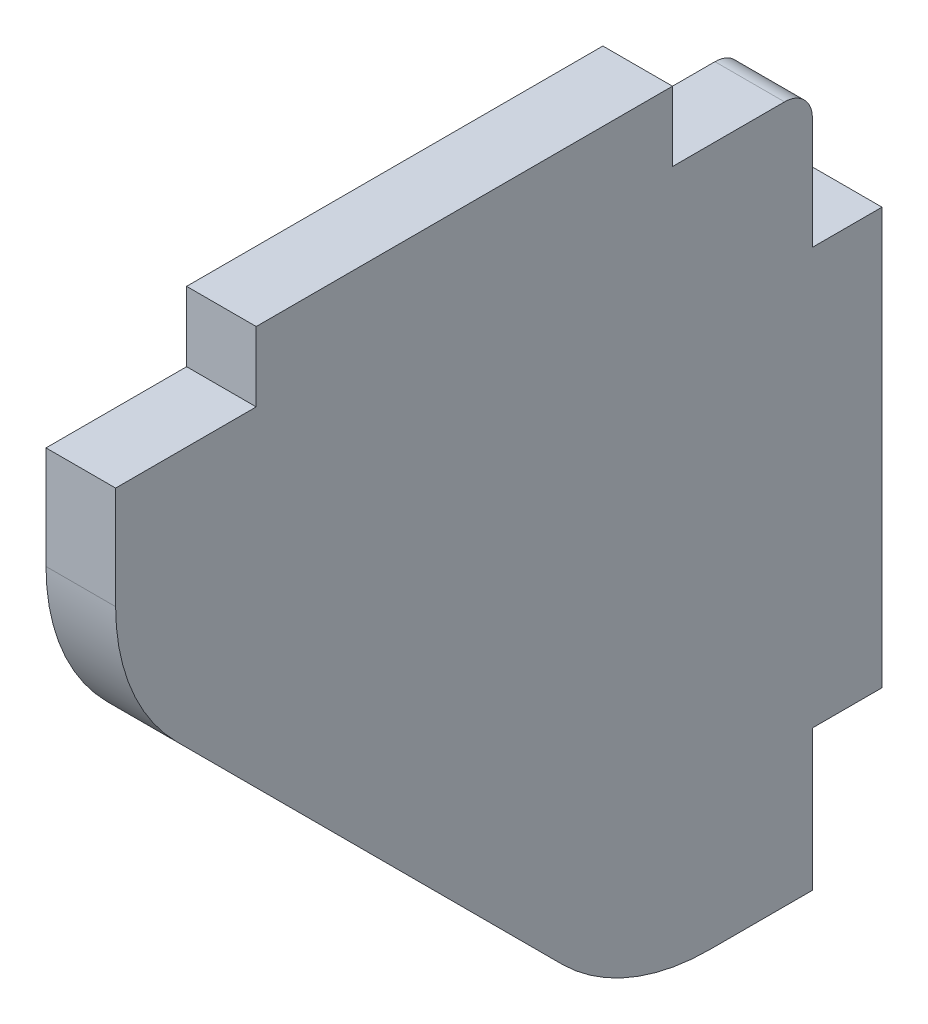
ISO-10303-21;
HEADER;
FILE_DESCRIPTION(('STEP AP214'),'2;1');
FILE_NAME('part.step','',(''),(''),'','','');
FILE_SCHEMA(('AUTOMOTIVE_DESIGN { 1 0 10303 214 1 1 1 1 }'));
ENDSEC;
DATA;
#1=APPLICATION_CONTEXT('core data for automotive mechanical design processes');
#2=APPLICATION_PROTOCOL_DEFINITION('international standard','automotive_design',2000,#1);
#3=PRODUCT_CONTEXT('',#1,'mechanical');
#4=PRODUCT('Part','Part','',(#3));
#5=PRODUCT_RELATED_PRODUCT_CATEGORY('part','',(#4));
#6=PRODUCT_DEFINITION_FORMATION('','',#4);
#7=PRODUCT_DEFINITION_CONTEXT('part definition',#1,'design');
#8=PRODUCT_DEFINITION('design','',#6,#7);
#9=PRODUCT_DEFINITION_SHAPE('','',#8);
#10=(LENGTH_UNIT() NAMED_UNIT(*) SI_UNIT(.MILLI.,.METRE.));
#11=(NAMED_UNIT(*) PLANE_ANGLE_UNIT() SI_UNIT($,.RADIAN.));
#12=(NAMED_UNIT(*) SI_UNIT($,.STERADIAN.) SOLID_ANGLE_UNIT());
#13=UNCERTAINTY_MEASURE_WITH_UNIT(LENGTH_MEASURE(1.E-05),#10,'distance_accuracy_value','');
#14=(GEOMETRIC_REPRESENTATION_CONTEXT(3) GLOBAL_UNCERTAINTY_ASSIGNED_CONTEXT((#13)) GLOBAL_UNIT_ASSIGNED_CONTEXT((#10,
#11,#12)) REPRESENTATION_CONTEXT('',''));
#15=CARTESIAN_POINT('',(0.,0.,0.));
#16=DIRECTION('',(0.,0.,1.));
#17=DIRECTION('',(1.,0.,0.));
#18=AXIS2_PLACEMENT_3D('',#15,#16,#17);
#19=CARTESIAN_POINT('',(145.9,0.,-49.9500000000004));
#20=DIRECTION('',(0.,-1.,0.));
#21=DIRECTION('',(0.,0.,-1.));
#22=AXIS2_PLACEMENT_3D('',#19,#20,#21);
#23=PLANE('',#22);
#24=DIRECTION('',(0.,0.,1.));
#25=VECTOR('',#24,1.);
#26=CARTESIAN_POINT('',(140.9,0.,-49.9500000000004));
#27=LINE('',#26,#25);
#28=CARTESIAN_POINT('',(140.9,0.,-49.9500000000004));
#29=VERTEX_POINT('',#28);
#30=CARTESIAN_POINT('',(140.9,0.,-20.0500000000004));
#31=VERTEX_POINT('',#30);
#32=EDGE_CURVE('E179',#29,#31,#27,.T.);
#33=ORIENTED_EDGE('',*,*,#32,.T.);
#34=DIRECTION('',(-1.,0.,0.));
#35=VECTOR('',#34,1.);
#36=CARTESIAN_POINT('',(145.9,0.,-20.0500000000004));
#37=LINE('',#36,#35);
#38=CARTESIAN_POINT('',(145.9,0.,-20.0500000000004));
#39=VERTEX_POINT('',#38);
#40=EDGE_CURVE('E11',#39,#31,#37,.T.);
#41=ORIENTED_EDGE('',*,*,#40,.F.);
#42=DIRECTION('',(0.,0.,1.));
#43=VECTOR('',#42,1.);
#44=CARTESIAN_POINT('',(145.9,0.,-49.9500000000004));
#45=LINE('',#44,#43);
#46=CARTESIAN_POINT('',(145.9,0.,-49.9500000000004));
#47=VERTEX_POINT('',#46);
#48=EDGE_CURVE('E209',#47,#39,#45,.T.);
#49=ORIENTED_EDGE('',*,*,#48,.F.);
#50=DIRECTION('',(-1.,0.,0.));
#51=VECTOR('',#50,1.);
#52=CARTESIAN_POINT('',(145.9,0.,-49.9500000000004));
#53=LINE('',#52,#51);
#54=EDGE_CURVE('E175',#47,#29,#53,.T.);
#55=ORIENTED_EDGE('',*,*,#54,.T.);
#56=EDGE_LOOP('',(#33,#41,#49,#55));
#57=FACE_BOUND('',#56,.T.);
#58=ADVANCED_FACE('F35',(#57),#23,.F.);
#59=CARTESIAN_POINT('',(145.9,0.,-20.0500000000004));
#60=DIRECTION('',(0.,0.,-1.));
#61=DIRECTION('',(-1.,0.,0.));
#62=AXIS2_PLACEMENT_3D('',#59,#60,#61);
#63=PLANE('',#62);
#64=DIRECTION('',(0.,-1.,0.));
#65=VECTOR('',#64,1.);
#66=CARTESIAN_POINT('',(140.9,0.,-20.0500000000004));
#67=LINE('',#66,#65);
#68=CARTESIAN_POINT('',(140.9,-5.,-20.0500000000004));
#69=VERTEX_POINT('',#68);
#70=EDGE_CURVE('E182',#31,#69,#67,.T.);
#71=ORIENTED_EDGE('',*,*,#70,.T.);
#72=DIRECTION('',(-1.,0.,0.));
#73=VECTOR('',#72,1.);
#74=CARTESIAN_POINT('',(145.9,-5.,-20.0500000000004));
#75=LINE('',#74,#73);
#76=CARTESIAN_POINT('',(145.9,-5.,-20.0500000000004));
#77=VERTEX_POINT('',#76);
#78=EDGE_CURVE('E43',#77,#69,#75,.T.);
#79=ORIENTED_EDGE('',*,*,#78,.F.);
#80=DIRECTION('',(0.,-1.,0.));
#81=VECTOR('',#80,1.);
#82=CARTESIAN_POINT('',(145.9,0.,-20.0500000000004));
#83=LINE('',#82,#81);
#84=EDGE_CURVE('E118',#39,#77,#83,.T.);
#85=ORIENTED_EDGE('',*,*,#84,.F.);
#86=ORIENTED_EDGE('',*,*,#40,.T.);
#87=EDGE_LOOP('',(#71,#79,#85,#86));
#88=FACE_BOUND('',#87,.T.);
#89=ADVANCED_FACE('F307',(#88),#63,.F.);
#90=CARTESIAN_POINT('',(145.9,-5.,-20.0500000000004));
#91=DIRECTION('',(0.,-1.,0.));
#92=DIRECTION('',(0.,0.,-1.));
#93=AXIS2_PLACEMENT_3D('',#90,#91,#92);
#94=PLANE('',#93);
#95=DIRECTION('',(0.,0.,1.));
#96=VECTOR('',#95,1.);
#97=CARTESIAN_POINT('',(140.9,-5.,-20.0500000000004));
#98=LINE('',#97,#96);
#99=CARTESIAN_POINT('',(140.9,-5.00000000000001,-9.95000000000038));
#100=VERTEX_POINT('',#99);
#101=EDGE_CURVE('E184',#69,#100,#98,.T.);
#102=ORIENTED_EDGE('',*,*,#101,.T.);
#103=DIRECTION('',(-1.,0.,0.));
#104=VECTOR('',#103,1.);
#105=CARTESIAN_POINT('',(145.9,-5.00000000000001,-9.95000000000038));
#106=LINE('',#105,#104);
#107=CARTESIAN_POINT('',(145.9,-5.00000000000001,-9.95000000000038));
#108=VERTEX_POINT('',#107);
#109=EDGE_CURVE('E240',#108,#100,#106,.T.);
#110=ORIENTED_EDGE('',*,*,#109,.F.);
#111=DIRECTION('',(0.,0.,1.));
#112=VECTOR('',#111,1.);
#113=CARTESIAN_POINT('',(145.9,-5.,-20.0500000000004));
#114=LINE('',#113,#112);
#115=EDGE_CURVE('E248',#77,#108,#114,.T.);
#116=ORIENTED_EDGE('',*,*,#115,.F.);
#117=ORIENTED_EDGE('',*,*,#78,.T.);
#118=EDGE_LOOP('',(#102,#110,#116,#117));
#119=FACE_BOUND('',#118,.T.);
#120=ADVANCED_FACE('F246',(#119),#94,.F.);
#121=CARTESIAN_POINT('',(145.9,-5.00000000000001,-9.95000000000038));
#122=DIRECTION('',(0.,0.,-1.));
#123=DIRECTION('',(-1.,0.,0.));
#124=AXIS2_PLACEMENT_3D('',#121,#122,#123);
#125=PLANE('',#124);
#126=DIRECTION('',(0.,-1.,0.));
#127=VECTOR('',#126,1.);
#128=CARTESIAN_POINT('',(140.9,-5.00000000000001,-9.95000000000038));
#129=LINE('',#128,#127);
#130=CARTESIAN_POINT('',(140.9,-12.3764068711932,-9.95000000000038));
#131=VERTEX_POINT('',#130);
#132=EDGE_CURVE('E186',#100,#131,#129,.T.);
#133=ORIENTED_EDGE('',*,*,#132,.T.);
#134=DIRECTION('',(-1.,0.,0.));
#135=VECTOR('',#134,1.);
#136=CARTESIAN_POINT('',(145.9,-12.3764068711932,-9.95000000000038));
#137=LINE('',#136,#135);
#138=CARTESIAN_POINT('',(145.9,-12.3764068711932,-9.95000000000038));
#139=VERTEX_POINT('',#138);
#140=EDGE_CURVE('E237',#139,#131,#137,.T.);
#141=ORIENTED_EDGE('',*,*,#140,.F.);
#142=DIRECTION('',(0.,-1.,0.));
#143=VECTOR('',#142,1.);
#144=CARTESIAN_POINT('',(145.9,-5.00000000000001,-9.95000000000038));
#145=LINE('',#144,#143);
#146=EDGE_CURVE('E266',#108,#139,#145,.T.);
#147=ORIENTED_EDGE('',*,*,#146,.F.);
#148=ORIENTED_EDGE('',*,*,#109,.T.);
#149=EDGE_LOOP('',(#133,#141,#147,#148));
#150=FACE_BOUND('',#149,.T.);
#151=ADVANCED_FACE('F257',(#150),#125,.F.);
#152=CARTESIAN_POINT('',(145.9,-12.3764068711932,-24.9500000000004));
#153=DIRECTION('',(-1.,0.,0.));
#154=DIRECTION('',(0.,0.,1.));
#155=AXIS2_PLACEMENT_3D('',#152,#153,#154);
#156=CYLINDRICAL_SURFACE('',#155,15.);
#157=CARTESIAN_POINT('',(140.9,-12.3764068711932,-24.9500000000004));
#158=DIRECTION('',(1.,0.,0.));
#159=DIRECTION('',(0.,0.,-1.));
#160=AXIS2_PLACEMENT_3D('',#157,#158,#159);
#161=CIRCLE('',#160,15.);
#162=CARTESIAN_POINT('',(140.9,-22.9830085889914,-14.3433982822022));
#163=VERTEX_POINT('',#162);
#164=EDGE_CURVE('E188',#131,#163,#161,.T.);
#165=ORIENTED_EDGE('',*,*,#164,.T.);
#166=DIRECTION('',(-1.,0.,0.));
#167=VECTOR('',#166,1.);
#168=CARTESIAN_POINT('',(145.9,-22.9830085889914,-14.3433982822022));
#169=LINE('',#168,#167);
#170=CARTESIAN_POINT('',(145.9,-22.9830085889914,-14.3433982822022));
#171=VERTEX_POINT('',#170);
#172=EDGE_CURVE('E234',#171,#163,#169,.T.);
#173=ORIENTED_EDGE('',*,*,#172,.F.);
#174=CARTESIAN_POINT('',(145.9,-12.3764068711932,-24.9500000000004));
#175=DIRECTION('',(1.,0.,0.));
#176=DIRECTION('',(0.,0.,-1.));
#177=AXIS2_PLACEMENT_3D('',#174,#175,#176);
#178=CIRCLE('',#177,15.);
#179=EDGE_CURVE('E263',#139,#171,#178,.T.);
#180=ORIENTED_EDGE('',*,*,#179,.F.);
#181=ORIENTED_EDGE('',*,*,#140,.T.);
#182=EDGE_LOOP('',(#165,#173,#180,#181));
#183=FACE_BOUND('',#182,.T.);
#184=ADVANCED_FACE('F261',(#183),#156,.T.);
#185=CARTESIAN_POINT('',(145.9,-22.9830085889914,-14.3433982822022));
#186=DIRECTION('',(0.,0.707106781186535,-0.70710678118656));
#187=DIRECTION('',(0.,0.70710678118656,0.707106781186535));
#188=AXIS2_PLACEMENT_3D('',#185,#186,#187);
#189=PLANE('',#188);
#190=DIRECTION('',(0.,-0.70710678118656,-0.707106781186535));
#191=VECTOR('',#190,1.);
#192=CARTESIAN_POINT('',(140.9,-22.9830085889914,-14.3433982822022));
#193=LINE('',#192,#191);
#194=CARTESIAN_POINT('',(140.9,-50.6566017177971,-42.0169914110069));
#195=VERTEX_POINT('',#194);
#196=EDGE_CURVE('E190',#163,#195,#193,.T.);
#197=ORIENTED_EDGE('',*,*,#196,.T.);
#198=DIRECTION('',(-1.,0.,0.));
#199=VECTOR('',#198,1.);
#200=CARTESIAN_POINT('',(145.9,-50.6566017177971,-42.0169914110069));
#201=LINE('',#200,#199);
#202=CARTESIAN_POINT('',(145.9,-50.6566017177971,-42.0169914110069));
#203=VERTEX_POINT('',#202);
#204=EDGE_CURVE('E231',#203,#195,#201,.T.);
#205=ORIENTED_EDGE('',*,*,#204,.F.);
#206=DIRECTION('',(0.,-0.70710678118656,-0.707106781186535));
#207=VECTOR('',#206,1.);
#208=CARTESIAN_POINT('',(145.9,-22.9830085889914,-14.3433982822022));
#209=LINE('',#208,#207);
#210=EDGE_CURVE('E265',#171,#203,#209,.T.);
#211=ORIENTED_EDGE('',*,*,#210,.F.);
#212=ORIENTED_EDGE('',*,*,#172,.T.);
#213=EDGE_LOOP('',(#197,#205,#211,#212));
#214=FACE_BOUND('',#213,.T.);
#215=ADVANCED_FACE('F320',(#214),#189,.F.);
#216=CARTESIAN_POINT('',(145.9,-40.0499999999989,-52.6235931288051));
#217=DIRECTION('',(-1.,0.,0.));
#218=DIRECTION('',(0.,0.,1.));
#219=AXIS2_PLACEMENT_3D('',#216,#217,#218);
#220=CYLINDRICAL_SURFACE('',#219,15.0000000000004);
#221=CARTESIAN_POINT('',(140.9,-40.0499999999989,-52.6235931288051));
#222=DIRECTION('',(1.,0.,0.));
#223=DIRECTION('',(0.,0.,1.));
#224=AXIS2_PLACEMENT_3D('',#221,#222,#223);
#225=CIRCLE('',#224,15.0000000000004);
#226=CARTESIAN_POINT('',(140.9,-55.0499999999993,-52.6235931288051));
#227=VERTEX_POINT('',#226);
#228=EDGE_CURVE('E192',#195,#227,#225,.T.);
#229=ORIENTED_EDGE('',*,*,#228,.T.);
#230=DIRECTION('',(-1.,0.,0.));
#231=VECTOR('',#230,1.);
#232=CARTESIAN_POINT('',(145.9,-55.0499999999993,-52.6235931288051));
#233=LINE('',#232,#231);
#234=CARTESIAN_POINT('',(145.9,-55.0499999999993,-52.6235931288051));
#235=VERTEX_POINT('',#234);
#236=EDGE_CURVE('E228',#235,#227,#233,.T.);
#237=ORIENTED_EDGE('',*,*,#236,.F.);
#238=CARTESIAN_POINT('',(145.9,-40.0499999999989,-52.6235931288051));
#239=DIRECTION('',(1.,0.,0.));
#240=DIRECTION('',(0.,0.,1.));
#241=AXIS2_PLACEMENT_3D('',#238,#239,#240);
#242=CIRCLE('',#241,15.0000000000004);
#243=EDGE_CURVE('E268',#203,#235,#242,.T.);
#244=ORIENTED_EDGE('',*,*,#243,.F.);
#245=ORIENTED_EDGE('',*,*,#204,.T.);
#246=EDGE_LOOP('',(#229,#237,#244,#245));
#247=FACE_BOUND('',#246,.T.);
#248=ADVANCED_FACE('F323',(#247),#220,.T.);
#249=CARTESIAN_POINT('',(145.9,-55.0499999999997,-60.));
#250=DIRECTION('',(0.,1.,0.));
#251=DIRECTION('',(0.,0.,1.));
#252=AXIS2_PLACEMENT_3D('',#249,#250,#251);
#253=PLANE('',#252);
#254=DIRECTION('',(0.,0.,-1.));
#255=VECTOR('',#254,1.);
#256=CARTESIAN_POINT('',(140.9,-55.0499999999997,-60.));
#257=LINE('',#256,#255);
#258=CARTESIAN_POINT('',(140.9,-55.0499999999997,-60.));
#259=VERTEX_POINT('',#258);
#260=EDGE_CURVE('E194',#227,#259,#257,.T.);
#261=ORIENTED_EDGE('',*,*,#260,.T.);
#262=DIRECTION('',(-1.,0.,0.));
#263=VECTOR('',#262,1.);
#264=CARTESIAN_POINT('',(145.9,-55.0499999999997,-60.));
#265=LINE('',#264,#263);
#266=CARTESIAN_POINT('',(145.9,-55.0499999999997,-60.));
#267=VERTEX_POINT('',#266);
#268=EDGE_CURVE('E225',#267,#259,#265,.T.);
#269=ORIENTED_EDGE('',*,*,#268,.F.);
#270=DIRECTION('',(0.,0.,-1.));
#271=VECTOR('',#270,1.);
#272=CARTESIAN_POINT('',(145.9,-55.0499999999997,-60.));
#273=LINE('',#272,#271);
#274=EDGE_CURVE('E274',#235,#267,#273,.T.);
#275=ORIENTED_EDGE('',*,*,#274,.F.);
#276=ORIENTED_EDGE('',*,*,#236,.T.);
#277=EDGE_LOOP('',(#261,#269,#275,#276));
#278=FACE_BOUND('',#277,.T.);
#279=ADVANCED_FACE('F327',(#278),#253,.F.);
#280=CARTESIAN_POINT('',(145.9,-55.0499999999997,-60.));
#281=DIRECTION('',(0.,0.,1.));
#282=DIRECTION('',(0.,-1.,0.));
#283=AXIS2_PLACEMENT_3D('',#280,#281,#282);
#284=PLANE('',#283);
#285=DIRECTION('',(0.,1.,0.));
#286=VECTOR('',#285,1.);
#287=CARTESIAN_POINT('',(140.9,-55.0499999999997,-60.));
#288=LINE('',#287,#286);
#289=CARTESIAN_POINT('',(140.9,-44.9499999999999,-60.0000000000001));
#290=VERTEX_POINT('',#289);
#291=EDGE_CURVE('E196',#259,#290,#288,.T.);
#292=ORIENTED_EDGE('',*,*,#291,.T.);
#293=DIRECTION('',(-1.,0.,0.));
#294=VECTOR('',#293,1.);
#295=CARTESIAN_POINT('',(145.9,-44.9499999999999,-60.0000000000001));
#296=LINE('',#295,#294);
#297=CARTESIAN_POINT('',(145.9,-44.9499999999999,-60.0000000000001));
#298=VERTEX_POINT('',#297);
#299=EDGE_CURVE('E222',#298,#290,#296,.T.);
#300=ORIENTED_EDGE('',*,*,#299,.F.);
#301=DIRECTION('',(0.,1.,0.));
#302=VECTOR('',#301,1.);
#303=CARTESIAN_POINT('',(145.9,-55.0499999999997,-60.));
#304=LINE('',#303,#302);
#305=EDGE_CURVE('E276',#267,#298,#304,.T.);
#306=ORIENTED_EDGE('',*,*,#305,.F.);
#307=ORIENTED_EDGE('',*,*,#268,.T.);
#308=EDGE_LOOP('',(#292,#300,#306,#307));
#309=FACE_BOUND('',#308,.T.);
#310=ADVANCED_FACE('F331',(#309),#284,.F.);
#311=CARTESIAN_POINT('',(145.9,-44.9499999999999,-60.0000000000001));
#312=DIRECTION('',(0.,1.,0.));
#313=DIRECTION('',(0.,0.,1.));
#314=AXIS2_PLACEMENT_3D('',#311,#312,#313);
#315=PLANE('',#314);
#316=DIRECTION('',(0.,0.,-1.));
#317=VECTOR('',#316,1.);
#318=CARTESIAN_POINT('',(140.9,-44.9499999999999,-60.0000000000001));
#319=LINE('',#318,#317);
#320=CARTESIAN_POINT('',(140.9,-44.9499999999999,-64.9999999999981));
#321=VERTEX_POINT('',#320);
#322=EDGE_CURVE('E198',#290,#321,#319,.T.);
#323=ORIENTED_EDGE('',*,*,#322,.T.);
#324=DIRECTION('',(-1.,0.,0.));
#325=VECTOR('',#324,1.);
#326=CARTESIAN_POINT('',(145.9,-44.9499999999999,-64.9999999999981));
#327=LINE('',#326,#325);
#328=CARTESIAN_POINT('',(145.9,-44.9499999999999,-64.9999999999981));
#329=VERTEX_POINT('',#328);
#330=EDGE_CURVE('E219',#329,#321,#327,.T.);
#331=ORIENTED_EDGE('',*,*,#330,.F.);
#332=DIRECTION('',(0.,0.,-1.));
#333=VECTOR('',#332,1.);
#334=CARTESIAN_POINT('',(145.9,-44.9499999999999,-60.0000000000001));
#335=LINE('',#334,#333);
#336=EDGE_CURVE('E278',#298,#329,#335,.T.);
#337=ORIENTED_EDGE('',*,*,#336,.F.);
#338=ORIENTED_EDGE('',*,*,#299,.T.);
#339=EDGE_LOOP('',(#323,#331,#337,#338));
#340=FACE_BOUND('',#339,.T.);
#341=ADVANCED_FACE('F335',(#340),#315,.F.);
#342=CARTESIAN_POINT('',(145.9,-44.9499999999999,-64.9999999999981));
#343=DIRECTION('',(0.,0.,1.));
#344=DIRECTION('',(1.,0.,0.));
#345=AXIS2_PLACEMENT_3D('',#342,#343,#344);
#346=PLANE('',#345);
#347=DIRECTION('',(0.,1.,0.));
#348=VECTOR('',#347,1.);
#349=CARTESIAN_POINT('',(140.9,-44.9499999999999,-64.9999999999981));
#350=LINE('',#349,#348);
#351=CARTESIAN_POINT('',(140.9,-15.0499999999999,-64.9999999999981));
#352=VERTEX_POINT('',#351);
#353=EDGE_CURVE('E200',#321,#352,#350,.T.);
#354=ORIENTED_EDGE('',*,*,#353,.T.);
#355=DIRECTION('',(-1.,0.,0.));
#356=VECTOR('',#355,1.);
#357=CARTESIAN_POINT('',(145.9,-15.0499999999999,-64.9999999999981));
#358=LINE('',#357,#356);
#359=CARTESIAN_POINT('',(145.9,-15.0499999999999,-64.9999999999981));
#360=VERTEX_POINT('',#359);
#361=EDGE_CURVE('E216',#360,#352,#358,.T.);
#362=ORIENTED_EDGE('',*,*,#361,.F.);
#363=DIRECTION('',(0.,1.,0.));
#364=VECTOR('',#363,1.);
#365=CARTESIAN_POINT('',(145.9,-44.9499999999999,-64.9999999999981));
#366=LINE('',#365,#364);
#367=EDGE_CURVE('E280',#329,#360,#366,.T.);
#368=ORIENTED_EDGE('',*,*,#367,.F.);
#369=ORIENTED_EDGE('',*,*,#330,.T.);
#370=EDGE_LOOP('',(#354,#362,#368,#369));
#371=FACE_BOUND('',#370,.T.);
#372=ADVANCED_FACE('F339',(#371),#346,.F.);
#373=CARTESIAN_POINT('',(145.9,-15.0499999999999,-64.9999999999981));
#374=DIRECTION('',(0.,-1.,0.));
#375=DIRECTION('',(0.,0.,-1.));
#376=AXIS2_PLACEMENT_3D('',#373,#374,#375);
#377=PLANE('',#376);
#378=DIRECTION('',(0.,0.,1.));
#379=VECTOR('',#378,1.);
#380=CARTESIAN_POINT('',(140.9,-15.0499999999999,-64.9999999999981));
#381=LINE('',#380,#379);
#382=CARTESIAN_POINT('',(140.9,-15.0499999999999,-60.0000000000001));
#383=VERTEX_POINT('',#382);
#384=EDGE_CURVE('E202',#352,#383,#381,.T.);
#385=ORIENTED_EDGE('',*,*,#384,.T.);
#386=DIRECTION('',(-1.,0.,0.));
#387=VECTOR('',#386,1.);
#388=CARTESIAN_POINT('',(145.9,-15.0499999999999,-60.0000000000001));
#389=LINE('',#388,#387);
#390=CARTESIAN_POINT('',(145.9,-15.0499999999999,-60.0000000000001));
#391=VERTEX_POINT('',#390);
#392=EDGE_CURVE('E213',#391,#383,#389,.T.);
#393=ORIENTED_EDGE('',*,*,#392,.F.);
#394=DIRECTION('',(0.,0.,1.));
#395=VECTOR('',#394,1.);
#396=CARTESIAN_POINT('',(145.9,-15.0499999999999,-64.9999999999981));
#397=LINE('',#396,#395);
#398=EDGE_CURVE('E282',#360,#391,#397,.T.);
#399=ORIENTED_EDGE('',*,*,#398,.F.);
#400=ORIENTED_EDGE('',*,*,#361,.T.);
#401=EDGE_LOOP('',(#385,#393,#399,#400));
#402=FACE_BOUND('',#401,.T.);
#403=ADVANCED_FACE('F288',(#402),#377,.F.);
#404=CARTESIAN_POINT('',(145.9,-15.0499999999999,-60.0000000000001));
#405=DIRECTION('',(0.,0.,1.));
#406=DIRECTION('',(1.,0.,0.));
#407=AXIS2_PLACEMENT_3D('',#404,#405,#406);
#408=PLANE('',#407);
#409=DIRECTION('',(0.,1.,0.));
#410=VECTOR('',#409,1.);
#411=CARTESIAN_POINT('',(140.9,-15.0499999999999,-60.0000000000001));
#412=LINE('',#411,#410);
#413=CARTESIAN_POINT('',(140.9,-7.,-60.0000000000001));
#414=VERTEX_POINT('',#413);
#415=EDGE_CURVE('E204',#383,#414,#412,.T.);
#416=ORIENTED_EDGE('',*,*,#415,.T.);
#417=DIRECTION('',(-1.,0.,0.));
#418=VECTOR('',#417,1.);
#419=CARTESIAN_POINT('',(145.9,-7.,-60.0000000000001));
#420=LINE('',#419,#418);
#421=CARTESIAN_POINT('',(145.9,-7.,-60.0000000000001));
#422=VERTEX_POINT('',#421);
#423=EDGE_CURVE('E170',#422,#414,#420,.T.);
#424=ORIENTED_EDGE('',*,*,#423,.F.);
#425=DIRECTION('',(0.,1.,0.));
#426=VECTOR('',#425,1.);
#427=CARTESIAN_POINT('',(145.9,-15.0499999999999,-60.0000000000001));
#428=LINE('',#427,#426);
#429=EDGE_CURVE('E161',#391,#422,#428,.T.);
#430=ORIENTED_EDGE('',*,*,#429,.F.);
#431=ORIENTED_EDGE('',*,*,#392,.T.);
#432=EDGE_LOOP('',(#416,#424,#430,#431));
#433=FACE_BOUND('',#432,.T.);
#434=ADVANCED_FACE('F292',(#433),#408,.F.);
#435=CARTESIAN_POINT('',(145.9,-7.,-58.));
#436=DIRECTION('',(-1.,0.,0.));
#437=DIRECTION('',(0.,0.,1.));
#438=AXIS2_PLACEMENT_3D('',#435,#436,#437);
#439=CYLINDRICAL_SURFACE('',#438,2.);
#440=CARTESIAN_POINT('',(140.9,-7.,-58.));
#441=DIRECTION('',(1.,0.,0.));
#442=DIRECTION('',(0.,0.,-1.));
#443=AXIS2_PLACEMENT_3D('',#440,#441,#442);
#444=CIRCLE('',#443,2.);
#445=CARTESIAN_POINT('',(140.9,-5.,-58.));
#446=VERTEX_POINT('',#445);
#447=EDGE_CURVE('E169',#414,#446,#444,.T.);
#448=ORIENTED_EDGE('',*,*,#447,.T.);
#449=DIRECTION('',(-1.,0.,0.));
#450=VECTOR('',#449,1.);
#451=CARTESIAN_POINT('',(145.9,-5.,-58.));
#452=LINE('',#451,#450);
#453=CARTESIAN_POINT('',(145.9,-5.,-58.));
#454=VERTEX_POINT('',#453);
#455=EDGE_CURVE('E166',#454,#446,#452,.T.);
#456=ORIENTED_EDGE('',*,*,#455,.F.);
#457=CARTESIAN_POINT('',(145.9,-7.,-58.));
#458=DIRECTION('',(1.,0.,0.));
#459=DIRECTION('',(0.,0.,-1.));
#460=AXIS2_PLACEMENT_3D('',#457,#458,#459);
#461=CIRCLE('',#460,2.);
#462=EDGE_CURVE('E155',#422,#454,#461,.T.);
#463=ORIENTED_EDGE('',*,*,#462,.F.);
#464=ORIENTED_EDGE('',*,*,#423,.T.);
#465=EDGE_LOOP('',(#448,#456,#463,#464));
#466=FACE_BOUND('',#465,.T.);
#467=ADVANCED_FACE('F167',(#466),#439,.T.);
#468=CARTESIAN_POINT('',(145.9,-5.,-58.));
#469=DIRECTION('',(0.,-1.,0.));
#470=DIRECTION('',(0.,0.,-1.));
#471=AXIS2_PLACEMENT_3D('',#468,#469,#470);
#472=PLANE('',#471);
#473=DIRECTION('',(0.,0.,1.));
#474=VECTOR('',#473,1.);
#475=CARTESIAN_POINT('',(140.9,-5.,-58.));
#476=LINE('',#475,#474);
#477=CARTESIAN_POINT('',(140.9,-5.00000000000001,-49.9500000000004));
#478=VERTEX_POINT('',#477);
#479=EDGE_CURVE('E104',#446,#478,#476,.T.);
#480=ORIENTED_EDGE('',*,*,#479,.T.);
#481=DIRECTION('',(-1.,0.,0.));
#482=VECTOR('',#481,1.);
#483=CARTESIAN_POINT('',(145.9,-5.00000000000001,-49.9500000000004));
#484=LINE('',#483,#482);
#485=CARTESIAN_POINT('',(145.9,-5.00000000000001,-49.9500000000004));
#486=VERTEX_POINT('',#485);
#487=EDGE_CURVE('E171',#486,#478,#484,.T.);
#488=ORIENTED_EDGE('',*,*,#487,.F.);
#489=DIRECTION('',(0.,0.,1.));
#490=VECTOR('',#489,1.);
#491=CARTESIAN_POINT('',(145.9,-5.,-58.));
#492=LINE('',#491,#490);
#493=EDGE_CURVE('E159',#454,#486,#492,.T.);
#494=ORIENTED_EDGE('',*,*,#493,.F.);
#495=ORIENTED_EDGE('',*,*,#455,.T.);
#496=EDGE_LOOP('',(#480,#488,#494,#495));
#497=FACE_BOUND('',#496,.T.);
#498=ADVANCED_FACE('F173',(#497),#472,.F.);
#499=CARTESIAN_POINT('',(145.9,-5.00000000000001,-49.9500000000004));
#500=DIRECTION('',(0.,0.,1.));
#501=DIRECTION('',(1.,0.,0.));
#502=AXIS2_PLACEMENT_3D('',#499,#500,#501);
#503=PLANE('',#502);
#504=DIRECTION('',(0.,1.,0.));
#505=VECTOR('',#504,1.);
#506=CARTESIAN_POINT('',(140.9,-5.00000000000001,-49.9500000000004));
#507=LINE('',#506,#505);
#508=EDGE_CURVE('E110',#478,#29,#507,.T.);
#509=ORIENTED_EDGE('',*,*,#508,.T.);
#510=ORIENTED_EDGE('',*,*,#54,.F.);
#511=DIRECTION('',(0.,1.,0.));
#512=VECTOR('',#511,1.);
#513=CARTESIAN_POINT('',(145.9,-5.00000000000001,-49.9500000000004));
#514=LINE('',#513,#512);
#515=EDGE_CURVE('E51',#486,#47,#514,.T.);
#516=ORIENTED_EDGE('',*,*,#515,.F.);
#517=ORIENTED_EDGE('',*,*,#487,.T.);
#518=EDGE_LOOP('',(#509,#510,#516,#517));
#519=FACE_BOUND('',#518,.T.);
#520=ADVANCED_FACE('F296',(#519),#503,.F.);
#521=CARTESIAN_POINT('',(145.9,-12.3764068711932,-24.9500000000004));
#522=DIRECTION('',(1.,0.,0.));
#523=DIRECTION('',(0.,0.,-1.));
#524=AXIS2_PLACEMENT_3D('',#521,#522,#523);
#525=PLANE('',#524);
#526=ORIENTED_EDGE('',*,*,#48,.T.);
#527=ORIENTED_EDGE('',*,*,#84,.T.);
#528=ORIENTED_EDGE('',*,*,#115,.T.);
#529=ORIENTED_EDGE('',*,*,#146,.T.);
#530=ORIENTED_EDGE('',*,*,#179,.T.);
#531=ORIENTED_EDGE('',*,*,#210,.T.);
#532=ORIENTED_EDGE('',*,*,#243,.T.);
#533=ORIENTED_EDGE('',*,*,#274,.T.);
#534=ORIENTED_EDGE('',*,*,#305,.T.);
#535=ORIENTED_EDGE('',*,*,#336,.T.);
#536=ORIENTED_EDGE('',*,*,#367,.T.);
#537=ORIENTED_EDGE('',*,*,#398,.T.);
#538=ORIENTED_EDGE('',*,*,#429,.T.);
#539=ORIENTED_EDGE('',*,*,#462,.T.);
#540=ORIENTED_EDGE('',*,*,#493,.T.);
#541=ORIENTED_EDGE('',*,*,#515,.T.);
#542=EDGE_LOOP('',(#526,#527,#528,#529,#530,#531,#532,#533,#534,#535,#536,#537,#538,#539,#540,#541));
#543=FACE_BOUND('',#542,.T.);
#544=ADVANCED_FACE('F157',(#543),#525,.T.);
#545=CARTESIAN_POINT('',(140.9,-12.3764068711932,-24.9500000000004));
#546=DIRECTION('',(1.,0.,0.));
#547=DIRECTION('',(0.,0.,-1.));
#548=AXIS2_PLACEMENT_3D('',#545,#546,#547);
#549=PLANE('',#548);
#550=ORIENTED_EDGE('',*,*,#32,.F.);
#551=ORIENTED_EDGE('',*,*,#508,.F.);
#552=ORIENTED_EDGE('',*,*,#479,.F.);
#553=ORIENTED_EDGE('',*,*,#447,.F.);
#554=ORIENTED_EDGE('',*,*,#415,.F.);
#555=ORIENTED_EDGE('',*,*,#384,.F.);
#556=ORIENTED_EDGE('',*,*,#353,.F.);
#557=ORIENTED_EDGE('',*,*,#322,.F.);
#558=ORIENTED_EDGE('',*,*,#291,.F.);
#559=ORIENTED_EDGE('',*,*,#260,.F.);
#560=ORIENTED_EDGE('',*,*,#228,.F.);
#561=ORIENTED_EDGE('',*,*,#196,.F.);
#562=ORIENTED_EDGE('',*,*,#164,.F.);
#563=ORIENTED_EDGE('',*,*,#132,.F.);
#564=ORIENTED_EDGE('',*,*,#101,.F.);
#565=ORIENTED_EDGE('',*,*,#70,.F.);
#566=EDGE_LOOP('',(#550,#551,#552,#553,#554,#555,#556,#557,#558,#559,#560,#561,#562,#563,#564,#565));
#567=FACE_BOUND('',#566,.T.);
#568=ADVANCED_FACE('F252',(#567),#549,.F.);
#569=CLOSED_SHELL('',(#58,#89,#120,#151,#184,#215,#248,#279,#310,#341,#372,#403,#434,#467,#498,
#520,#544,#568));
#570=MANIFOLD_SOLID_BREP('B2',#569);
#571=ADVANCED_BREP_SHAPE_REPRESENTATION('',(#18,#570),#14);
#572=SHAPE_DEFINITION_REPRESENTATION(#9,#571);
ENDSEC;
END-ISO-10303-21;
